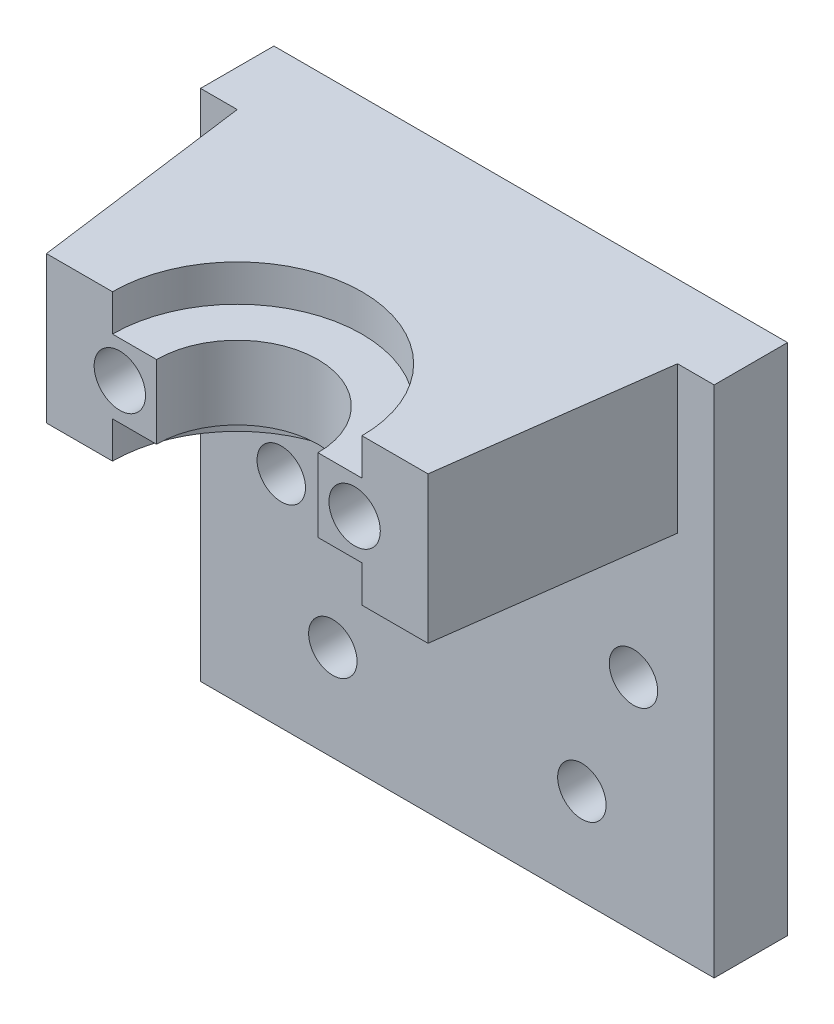
ISO-10303-21;
HEADER;
FILE_DESCRIPTION(('STEP AP214'),'2;1');
FILE_NAME('part.step','',(''),(''),'','','');
FILE_SCHEMA(('AUTOMOTIVE_DESIGN { 1 0 10303 214 1 1 1 1 }'));
ENDSEC;
DATA;
#1=APPLICATION_CONTEXT('core data for automotive mechanical design processes');
#2=APPLICATION_PROTOCOL_DEFINITION('international standard','automotive_design',2000,#1);
#3=PRODUCT_CONTEXT('',#1,'mechanical');
#4=PRODUCT('Part','Part','',(#3));
#5=PRODUCT_RELATED_PRODUCT_CATEGORY('part','',(#4));
#6=PRODUCT_DEFINITION_FORMATION('','',#4);
#7=PRODUCT_DEFINITION_CONTEXT('part definition',#1,'design');
#8=PRODUCT_DEFINITION('design','',#6,#7);
#9=PRODUCT_DEFINITION_SHAPE('','',#8);
#10=(LENGTH_UNIT() NAMED_UNIT(*) SI_UNIT(.MILLI.,.METRE.));
#11=(NAMED_UNIT(*) PLANE_ANGLE_UNIT() SI_UNIT($,.RADIAN.));
#12=(NAMED_UNIT(*) SI_UNIT($,.STERADIAN.) SOLID_ANGLE_UNIT());
#13=UNCERTAINTY_MEASURE_WITH_UNIT(LENGTH_MEASURE(1.E-05),#10,'distance_accuracy_value','');
#14=(GEOMETRIC_REPRESENTATION_CONTEXT(3) GLOBAL_UNCERTAINTY_ASSIGNED_CONTEXT((#13)) GLOBAL_UNIT_ASSIGNED_CONTEXT((#10,
#11,#12)) REPRESENTATION_CONTEXT('',''));
#15=CARTESIAN_POINT('',(0.,0.,0.));
#16=DIRECTION('',(0.,0.,1.));
#17=DIRECTION('',(1.,0.,0.));
#18=AXIS2_PLACEMENT_3D('',#15,#16,#17);
#19=CARTESIAN_POINT('',(0.,0.,5.));
#20=DIRECTION('',(0.,0.,1.));
#21=DIRECTION('',(1.,0.,0.));
#22=AXIS2_PLACEMENT_3D('',#19,#20,#21);
#23=PLANE('',#22);
#24=CARTESIAN_POINT('',(-12.,0.,5.));
#25=DIRECTION('',(0.,0.,1.));
#26=DIRECTION('',(1.,0.,0.));
#27=AXIS2_PLACEMENT_3D('',#24,#25,#26);
#28=CIRCLE('',#27,1.65);
#29=CARTESIAN_POINT('',(-10.35,0.,5.));
#30=VERTEX_POINT('',#29);
#31=EDGE_CURVE('E266',#30,#30,#28,.T.);
#32=ORIENTED_EDGE('',*,*,#31,.F.);
#33=EDGE_LOOP('',(#32));
#34=FACE_BOUND('',#33,.T.);
#35=CARTESIAN_POINT('',(8.48528137423857,-8.48528137423857,5.));
#36=DIRECTION('',(0.,0.,1.));
#37=DIRECTION('',(1.,0.,0.));
#38=AXIS2_PLACEMENT_3D('',#35,#36,#37);
#39=CIRCLE('',#38,1.65);
#40=CARTESIAN_POINT('',(10.1352813742386,-8.48528137423857,5.));
#41=VERTEX_POINT('',#40);
#42=EDGE_CURVE('E278',#41,#41,#39,.T.);
#43=ORIENTED_EDGE('',*,*,#42,.F.);
#44=EDGE_LOOP('',(#43));
#45=FACE_BOUND('',#44,.T.);
#46=CARTESIAN_POINT('',(12.,0.,5.));
#47=DIRECTION('',(0.,0.,1.));
#48=DIRECTION('',(1.,0.,0.));
#49=AXIS2_PLACEMENT_3D('',#46,#47,#48);
#50=CIRCLE('',#49,1.65);
#51=CARTESIAN_POINT('',(13.65,0.,5.));
#52=VERTEX_POINT('',#51);
#53=EDGE_CURVE('E284',#52,#52,#50,.T.);
#54=ORIENTED_EDGE('',*,*,#53,.F.);
#55=EDGE_LOOP('',(#54));
#56=FACE_BOUND('',#55,.T.);
#57=CARTESIAN_POINT('',(-8.48528137423857,-8.48528137423857,5.));
#58=DIRECTION('',(0.,0.,1.));
#59=DIRECTION('',(1.,0.,0.));
#60=AXIS2_PLACEMENT_3D('',#57,#58,#59);
#61=CIRCLE('',#60,1.65);
#62=CARTESIAN_POINT('',(-6.83528137423857,-8.48528137423857,5.));
#63=VERTEX_POINT('',#62);
#64=EDGE_CURVE('E272',#63,#63,#61,.T.);
#65=ORIENTED_EDGE('',*,*,#64,.F.);
#66=EDGE_LOOP('',(#65));
#67=FACE_BOUND('',#66,.T.);
#68=DIRECTION('',(0.,1.,0.));
#69=VECTOR('',#68,1.);
#70=CARTESIAN_POINT('',(17.5,0.,5.));
#71=LINE('',#70,#69);
#72=CARTESIAN_POINT('',(17.5,-15.,5.));
#73=VERTEX_POINT('',#72);
#74=CARTESIAN_POINT('',(17.5,20.,5.));
#75=VERTEX_POINT('',#74);
#76=EDGE_CURVE('E178',#73,#75,#71,.T.);
#77=ORIENTED_EDGE('',*,*,#76,.T.);
#78=DIRECTION('',(-1.,0.,0.));
#79=VECTOR('',#78,1.);
#80=CARTESIAN_POINT('',(0.,20.,5.));
#81=LINE('',#80,#79);
#82=CARTESIAN_POINT('',(15.,20.,5.));
#83=VERTEX_POINT('',#82);
#84=EDGE_CURVE('E174',#75,#83,#81,.T.);
#85=ORIENTED_EDGE('',*,*,#84,.T.);
#86=DIRECTION('',(0.,-1.,0.));
#87=VECTOR('',#86,1.);
#88=CARTESIAN_POINT('',(15.,20.,5.));
#89=LINE('',#88,#87);
#90=CARTESIAN_POINT('',(15.,10.,5.));
#91=VERTEX_POINT('',#90);
#92=EDGE_CURVE('E242',#83,#91,#89,.T.);
#93=ORIENTED_EDGE('',*,*,#92,.T.);
#94=DIRECTION('',(-1.,0.,0.));
#95=VECTOR('',#94,1.);
#96=CARTESIAN_POINT('',(15.,10.,5.));
#97=LINE('',#96,#95);
#98=CARTESIAN_POINT('',(9.13959588941565,10.,5.));
#99=VERTEX_POINT('',#98);
#100=EDGE_CURVE('E226',#91,#99,#97,.T.);
#101=ORIENTED_EDGE('',*,*,#100,.T.);
#102=CARTESIAN_POINT('',(8.48528137423857,8.48528137423857,5.));
#103=DIRECTION('',(0.,0.,1.));
#104=DIRECTION('',(1.,0.,0.));
#105=AXIS2_PLACEMENT_3D('',#102,#103,#104);
#106=CIRCLE('',#105,1.65);
#107=CARTESIAN_POINT('',(7.83096685906149,10.,5.));
#108=VERTEX_POINT('',#107);
#109=EDGE_CURVE('E256',#108,#99,#106,.T.);
#110=ORIENTED_EDGE('',*,*,#109,.F.);
#111=CARTESIAN_POINT('',(-7.8309668590615,10.,5.));
#112=VERTEX_POINT('',#111);
#113=EDGE_CURVE('E288',#108,#112,#97,.T.);
#114=ORIENTED_EDGE('',*,*,#113,.T.);
#115=CARTESIAN_POINT('',(-8.48528137423857,8.48528137423857,5.));
#116=DIRECTION('',(0.,0.,1.));
#117=DIRECTION('',(1.,0.,0.));
#118=AXIS2_PLACEMENT_3D('',#115,#116,#117);
#119=CIRCLE('',#118,1.65);
#120=CARTESIAN_POINT('',(-9.13959588941565,10.,5.));
#121=VERTEX_POINT('',#120);
#122=EDGE_CURVE('E263',#121,#112,#119,.T.);
#123=ORIENTED_EDGE('',*,*,#122,.F.);
#124=CARTESIAN_POINT('',(-15.,10.,5.));
#125=VERTEX_POINT('',#124);
#126=EDGE_CURVE('E231',#121,#125,#97,.T.);
#127=ORIENTED_EDGE('',*,*,#126,.T.);
#128=DIRECTION('',(0.,-1.,0.));
#129=VECTOR('',#128,1.);
#130=CARTESIAN_POINT('',(-15.,20.,5.));
#131=LINE('',#130,#129);
#132=CARTESIAN_POINT('',(-15.,20.,5.));
#133=VERTEX_POINT('',#132);
#134=EDGE_CURVE('E240',#133,#125,#131,.T.);
#135=ORIENTED_EDGE('',*,*,#134,.F.);
#136=CARTESIAN_POINT('',(-17.5,20.,5.));
#137=VERTEX_POINT('',#136);
#138=EDGE_CURVE('E169',#133,#137,#81,.T.);
#139=ORIENTED_EDGE('',*,*,#138,.T.);
#140=DIRECTION('',(0.,-1.,0.));
#141=VECTOR('',#140,1.);
#142=CARTESIAN_POINT('',(-17.5,0.,5.));
#143=LINE('',#142,#141);
#144=CARTESIAN_POINT('',(-17.5,-15.,5.));
#145=VERTEX_POINT('',#144);
#146=EDGE_CURVE('E175',#137,#145,#143,.T.);
#147=ORIENTED_EDGE('',*,*,#146,.T.);
#148=DIRECTION('',(1.,0.,0.));
#149=VECTOR('',#148,1.);
#150=CARTESIAN_POINT('',(0.,-15.,5.));
#151=LINE('',#150,#149);
#152=EDGE_CURVE('E152',#145,#73,#151,.T.);
#153=ORIENTED_EDGE('',*,*,#152,.T.);
#154=EDGE_LOOP('',(#77,#85,#93,#101,#110,#114,#123,#127,#135,#139,#147,#153));
#155=FACE_BOUND('',#154,.T.);
#156=ADVANCED_FACE('F32',(#34,#45,#56,#67,#155),#23,.T.);
#157=CARTESIAN_POINT('',(0.,0.,0.));
#158=DIRECTION('',(0.,0.,1.));
#159=DIRECTION('',(1.,0.,0.));
#160=AXIS2_PLACEMENT_3D('',#157,#158,#159);
#161=PLANE('',#160);
#162=CARTESIAN_POINT('',(7.99999999999998,15.,0.));
#163=DIRECTION('',(0.,0.,1.));
#164=DIRECTION('',(1.,0.,0.));
#165=AXIS2_PLACEMENT_3D('',#162,#163,#164);
#166=CIRCLE('',#165,1.75);
#167=CARTESIAN_POINT('',(9.74999999999998,15.,0.));
#168=VERTEX_POINT('',#167);
#169=EDGE_CURVE('E425',#168,#168,#166,.T.);
#170=ORIENTED_EDGE('',*,*,#169,.T.);
#171=EDGE_LOOP('',(#170));
#172=FACE_BOUND('',#171,.T.);
#173=CARTESIAN_POINT('',(-8.00000000000002,15.,0.));
#174=DIRECTION('',(0.,0.,1.));
#175=DIRECTION('',(1.,0.,0.));
#176=AXIS2_PLACEMENT_3D('',#173,#174,#175);
#177=CIRCLE('',#176,1.75);
#178=CARTESIAN_POINT('',(-6.25000000000002,15.,0.));
#179=VERTEX_POINT('',#178);
#180=EDGE_CURVE('E433',#179,#179,#177,.T.);
#181=ORIENTED_EDGE('',*,*,#180,.T.);
#182=EDGE_LOOP('',(#181));
#183=FACE_BOUND('',#182,.T.);
#184=CARTESIAN_POINT('',(8.48528137423857,8.48528137423857,0.));
#185=DIRECTION('',(0.,0.,1.));
#186=DIRECTION('',(1.,0.,0.));
#187=AXIS2_PLACEMENT_3D('',#184,#185,#186);
#188=CIRCLE('',#187,1.65);
#189=CARTESIAN_POINT('',(10.1352813742386,8.48528137423857,0.));
#190=VERTEX_POINT('',#189);
#191=EDGE_CURVE('E251',#190,#190,#188,.T.);
#192=ORIENTED_EDGE('',*,*,#191,.T.);
#193=EDGE_LOOP('',(#192));
#194=FACE_BOUND('',#193,.T.);
#195=CARTESIAN_POINT('',(-8.48528137423857,8.48528137423857,0.));
#196=DIRECTION('',(0.,0.,1.));
#197=DIRECTION('',(1.,0.,0.));
#198=AXIS2_PLACEMENT_3D('',#195,#196,#197);
#199=CIRCLE('',#198,1.65);
#200=CARTESIAN_POINT('',(-6.83528137423857,8.48528137423857,0.));
#201=VERTEX_POINT('',#200);
#202=EDGE_CURVE('E255',#201,#201,#199,.T.);
#203=ORIENTED_EDGE('',*,*,#202,.T.);
#204=EDGE_LOOP('',(#203));
#205=FACE_BOUND('',#204,.T.);
#206=CARTESIAN_POINT('',(-12.,0.,0.));
#207=DIRECTION('',(0.,0.,1.));
#208=DIRECTION('',(1.,0.,0.));
#209=AXIS2_PLACEMENT_3D('',#206,#207,#208);
#210=CIRCLE('',#209,1.65);
#211=CARTESIAN_POINT('',(-10.35,0.,0.));
#212=VERTEX_POINT('',#211);
#213=EDGE_CURVE('E262',#212,#212,#210,.T.);
#214=ORIENTED_EDGE('',*,*,#213,.T.);
#215=EDGE_LOOP('',(#214));
#216=FACE_BOUND('',#215,.T.);
#217=CARTESIAN_POINT('',(-8.48528137423857,-8.48528137423857,0.));
#218=DIRECTION('',(0.,0.,1.));
#219=DIRECTION('',(1.,0.,0.));
#220=AXIS2_PLACEMENT_3D('',#217,#218,#219);
#221=CIRCLE('',#220,1.65);
#222=CARTESIAN_POINT('',(-6.83528137423857,-8.48528137423857,0.));
#223=VERTEX_POINT('',#222);
#224=EDGE_CURVE('E269',#223,#223,#221,.T.);
#225=ORIENTED_EDGE('',*,*,#224,.T.);
#226=EDGE_LOOP('',(#225));
#227=FACE_BOUND('',#226,.T.);
#228=CARTESIAN_POINT('',(8.48528137423857,-8.48528137423857,0.));
#229=DIRECTION('',(0.,0.,1.));
#230=DIRECTION('',(1.,0.,0.));
#231=AXIS2_PLACEMENT_3D('',#228,#229,#230);
#232=CIRCLE('',#231,1.65);
#233=CARTESIAN_POINT('',(10.1352813742386,-8.48528137423857,0.));
#234=VERTEX_POINT('',#233);
#235=EDGE_CURVE('E275',#234,#234,#232,.T.);
#236=ORIENTED_EDGE('',*,*,#235,.T.);
#237=EDGE_LOOP('',(#236));
#238=FACE_BOUND('',#237,.T.);
#239=CARTESIAN_POINT('',(12.,0.,0.));
#240=DIRECTION('',(0.,0.,1.));
#241=DIRECTION('',(1.,0.,0.));
#242=AXIS2_PLACEMENT_3D('',#239,#240,#241);
#243=CIRCLE('',#242,1.65);
#244=CARTESIAN_POINT('',(13.65,0.,0.));
#245=VERTEX_POINT('',#244);
#246=EDGE_CURVE('E281',#245,#245,#243,.T.);
#247=ORIENTED_EDGE('',*,*,#246,.T.);
#248=EDGE_LOOP('',(#247));
#249=FACE_BOUND('',#248,.T.);
#250=DIRECTION('',(0.,1.,0.));
#251=VECTOR('',#250,1.);
#252=CARTESIAN_POINT('',(17.5,-15.,0.));
#253=LINE('',#252,#251);
#254=CARTESIAN_POINT('',(17.5,-15.,0.));
#255=VERTEX_POINT('',#254);
#256=CARTESIAN_POINT('',(17.5,20.,0.));
#257=VERTEX_POINT('',#256);
#258=EDGE_CURVE('E55',#255,#257,#253,.T.);
#259=ORIENTED_EDGE('',*,*,#258,.F.);
#260=DIRECTION('',(1.,0.,0.));
#261=VECTOR('',#260,1.);
#262=CARTESIAN_POINT('',(-17.5,-15.,0.));
#263=LINE('',#262,#261);
#264=CARTESIAN_POINT('',(-17.5,-15.,0.));
#265=VERTEX_POINT('',#264);
#266=EDGE_CURVE('E150',#265,#255,#263,.T.);
#267=ORIENTED_EDGE('',*,*,#266,.F.);
#268=DIRECTION('',(0.,-1.,0.));
#269=VECTOR('',#268,1.);
#270=CARTESIAN_POINT('',(-17.5,-15.,0.));
#271=LINE('',#270,#269);
#272=CARTESIAN_POINT('',(-17.5,20.,0.));
#273=VERTEX_POINT('',#272);
#274=EDGE_CURVE('E158',#273,#265,#271,.T.);
#275=ORIENTED_EDGE('',*,*,#274,.F.);
#276=DIRECTION('',(-1.,0.,0.));
#277=VECTOR('',#276,1.);
#278=CARTESIAN_POINT('',(-17.5,20.,0.));
#279=LINE('',#278,#277);
#280=EDGE_CURVE('E162',#257,#273,#279,.T.);
#281=ORIENTED_EDGE('',*,*,#280,.F.);
#282=EDGE_LOOP('',(#259,#267,#275,#281));
#283=FACE_BOUND('',#282,.T.);
#284=ADVANCED_FACE('F34',(#172,#183,#194,#205,#216,#227,#238,#249,#283),#161,.F.);
#285=CARTESIAN_POINT('',(0.,20.,20.));
#286=DIRECTION('',(0.,-1.,0.));
#287=DIRECTION('',(0.,0.,-1.));
#288=AXIS2_PLACEMENT_3D('',#285,#286,#287);
#289=CYLINDRICAL_SURFACE('',#288,5.5);
#290=CARTESIAN_POINT('',(0.,12.5,20.));
#291=DIRECTION('',(0.,-1.,0.));
#292=DIRECTION('',(0.,0.,-1.));
#293=AXIS2_PLACEMENT_3D('',#290,#291,#292);
#294=CIRCLE('',#293,5.5);
#295=CARTESIAN_POINT('',(5.5,12.5,20.));
#296=VERTEX_POINT('',#295);
#297=CARTESIAN_POINT('',(-5.5,12.5,20.));
#298=VERTEX_POINT('',#297);
#299=EDGE_CURVE('E191',#296,#298,#294,.F.);
#300=ORIENTED_EDGE('',*,*,#299,.F.);
#301=DIRECTION('',(0.,-1.,0.));
#302=VECTOR('',#301,1.);
#303=CARTESIAN_POINT('',(5.5,20.,20.));
#304=LINE('',#303,#302);
#305=CARTESIAN_POINT('',(5.5,17.5,20.));
#306=VERTEX_POINT('',#305);
#307=EDGE_CURVE('E248',#306,#296,#304,.T.);
#308=ORIENTED_EDGE('',*,*,#307,.F.);
#309=CARTESIAN_POINT('',(0.,17.5,20.));
#310=DIRECTION('',(0.,1.,0.));
#311=DIRECTION('',(0.,0.,1.));
#312=AXIS2_PLACEMENT_3D('',#309,#310,#311);
#313=CIRCLE('',#312,5.5);
#314=CARTESIAN_POINT('',(-5.5,17.5,20.));
#315=VERTEX_POINT('',#314);
#316=EDGE_CURVE('E204',#315,#306,#313,.F.);
#317=ORIENTED_EDGE('',*,*,#316,.F.);
#318=DIRECTION('',(0.,-1.,0.));
#319=VECTOR('',#318,1.);
#320=CARTESIAN_POINT('',(-5.5,20.,20.));
#321=LINE('',#320,#319);
#322=EDGE_CURVE('E220',#315,#298,#321,.T.);
#323=ORIENTED_EDGE('',*,*,#322,.T.);
#324=EDGE_LOOP('',(#300,#308,#317,#323));
#325=FACE_BOUND('',#324,.T.);
#326=ADVANCED_FACE('F318',(#325),#289,.F.);
#327=CARTESIAN_POINT('',(5.5,20.,20.));
#328=DIRECTION('',(0.,0.,-1.));
#329=DIRECTION('',(-1.,0.,0.));
#330=AXIS2_PLACEMENT_3D('',#327,#328,#329);
#331=PLANE('',#330);
#332=CARTESIAN_POINT('',(7.99999999999998,15.,20.));
#333=DIRECTION('',(0.,0.,1.));
#334=DIRECTION('',(1.,0.,0.));
#335=AXIS2_PLACEMENT_3D('',#332,#333,#334);
#336=CIRCLE('',#335,1.75);
#337=CARTESIAN_POINT('',(9.74999999999998,15.,20.));
#338=VERTEX_POINT('',#337);
#339=EDGE_CURVE('E428',#338,#338,#336,.T.);
#340=ORIENTED_EDGE('',*,*,#339,.F.);
#341=EDGE_LOOP('',(#340));
#342=FACE_BOUND('',#341,.T.);
#343=DIRECTION('',(-1.,0.,0.));
#344=VECTOR('',#343,1.);
#345=CARTESIAN_POINT('',(5.5,12.5,20.));
#346=LINE('',#345,#344);
#347=CARTESIAN_POINT('',(8.5,12.5,20.));
#348=VERTEX_POINT('',#347);
#349=EDGE_CURVE('E193',#348,#296,#346,.T.);
#350=ORIENTED_EDGE('',*,*,#349,.F.);
#351=DIRECTION('',(0.,1.,0.));
#352=VECTOR('',#351,1.);
#353=CARTESIAN_POINT('',(8.5,20.,20.));
#354=LINE('',#353,#352);
#355=CARTESIAN_POINT('',(8.5,10.,20.));
#356=VERTEX_POINT('',#355);
#357=EDGE_CURVE('E189',#356,#348,#354,.T.);
#358=ORIENTED_EDGE('',*,*,#357,.F.);
#359=DIRECTION('',(1.,0.,0.));
#360=VECTOR('',#359,1.);
#361=CARTESIAN_POINT('',(5.5,10.,20.));
#362=LINE('',#361,#360);
#363=CARTESIAN_POINT('',(13.,10.,20.));
#364=VERTEX_POINT('',#363);
#365=EDGE_CURVE('E208',#356,#364,#362,.T.);
#366=ORIENTED_EDGE('',*,*,#365,.T.);
#367=DIRECTION('',(0.,-1.,0.));
#368=VECTOR('',#367,1.);
#369=CARTESIAN_POINT('',(13.,20.,20.));
#370=LINE('',#369,#368);
#371=CARTESIAN_POINT('',(13.,20.,20.));
#372=VERTEX_POINT('',#371);
#373=EDGE_CURVE('E245',#372,#364,#370,.T.);
#374=ORIENTED_EDGE('',*,*,#373,.F.);
#375=DIRECTION('',(1.,0.,0.));
#376=VECTOR('',#375,1.);
#377=CARTESIAN_POINT('',(5.5,20.,20.));
#378=LINE('',#377,#376);
#379=CARTESIAN_POINT('',(8.5,20.,20.));
#380=VERTEX_POINT('',#379);
#381=EDGE_CURVE('E209',#380,#372,#378,.T.);
#382=ORIENTED_EDGE('',*,*,#381,.F.);
#383=DIRECTION('',(0.,1.,0.));
#384=VECTOR('',#383,1.);
#385=CARTESIAN_POINT('',(8.5,20.,20.));
#386=LINE('',#385,#384);
#387=CARTESIAN_POINT('',(8.5,17.5,20.));
#388=VERTEX_POINT('',#387);
#389=EDGE_CURVE('E202',#388,#380,#386,.T.);
#390=ORIENTED_EDGE('',*,*,#389,.F.);
#391=DIRECTION('',(1.,0.,0.));
#392=VECTOR('',#391,1.);
#393=CARTESIAN_POINT('',(5.5,17.5,20.));
#394=LINE('',#393,#392);
#395=EDGE_CURVE('E206',#306,#388,#394,.T.);
#396=ORIENTED_EDGE('',*,*,#395,.F.);
#397=ORIENTED_EDGE('',*,*,#307,.T.);
#398=EDGE_LOOP('',(#350,#358,#366,#374,#382,#390,#396,#397));
#399=FACE_BOUND('',#398,.T.);
#400=ADVANCED_FACE('F341',(#342,#399),#331,.F.);
#401=CARTESIAN_POINT('',(-13.,20.,20.));
#402=DIRECTION('',(0.,0.,-1.));
#403=DIRECTION('',(-1.,0.,0.));
#404=AXIS2_PLACEMENT_3D('',#401,#402,#403);
#405=PLANE('',#404);
#406=CARTESIAN_POINT('',(-8.00000000000002,15.,20.));
#407=DIRECTION('',(0.,0.,1.));
#408=DIRECTION('',(1.,0.,0.));
#409=AXIS2_PLACEMENT_3D('',#406,#407,#408);
#410=CIRCLE('',#409,1.75);
#411=CARTESIAN_POINT('',(-6.25000000000002,15.,20.));
#412=VERTEX_POINT('',#411);
#413=EDGE_CURVE('E430',#412,#412,#410,.T.);
#414=ORIENTED_EDGE('',*,*,#413,.F.);
#415=EDGE_LOOP('',(#414));
#416=FACE_BOUND('',#415,.T.);
#417=DIRECTION('',(-1.,0.,0.));
#418=VECTOR('',#417,1.);
#419=CARTESIAN_POINT('',(-13.,12.5,20.));
#420=LINE('',#419,#418);
#421=CARTESIAN_POINT('',(-8.5,12.5,20.));
#422=VERTEX_POINT('',#421);
#423=EDGE_CURVE('E11',#298,#422,#420,.T.);
#424=ORIENTED_EDGE('',*,*,#423,.F.);
#425=ORIENTED_EDGE('',*,*,#322,.F.);
#426=DIRECTION('',(1.,0.,0.));
#427=VECTOR('',#426,1.);
#428=CARTESIAN_POINT('',(-13.,17.5,20.));
#429=LINE('',#428,#427);
#430=CARTESIAN_POINT('',(-8.5,17.5,20.));
#431=VERTEX_POINT('',#430);
#432=EDGE_CURVE('E40',#431,#315,#429,.T.);
#433=ORIENTED_EDGE('',*,*,#432,.F.);
#434=DIRECTION('',(0.,1.,0.));
#435=VECTOR('',#434,1.);
#436=CARTESIAN_POINT('',(-8.5,20.,20.));
#437=LINE('',#436,#435);
#438=CARTESIAN_POINT('',(-8.5,20.,20.));
#439=VERTEX_POINT('',#438);
#440=EDGE_CURVE('E200',#439,#431,#437,.F.);
#441=ORIENTED_EDGE('',*,*,#440,.F.);
#442=DIRECTION('',(1.,0.,0.));
#443=VECTOR('',#442,1.);
#444=CARTESIAN_POINT('',(-13.,20.,20.));
#445=LINE('',#444,#443);
#446=CARTESIAN_POINT('',(-13.,20.,20.));
#447=VERTEX_POINT('',#446);
#448=EDGE_CURVE('E217',#447,#439,#445,.T.);
#449=ORIENTED_EDGE('',*,*,#448,.F.);
#450=DIRECTION('',(0.,-1.,0.));
#451=VECTOR('',#450,1.);
#452=CARTESIAN_POINT('',(-13.,20.,20.));
#453=LINE('',#452,#451);
#454=CARTESIAN_POINT('',(-13.,10.,20.));
#455=VERTEX_POINT('',#454);
#456=EDGE_CURVE('E237',#447,#455,#453,.T.);
#457=ORIENTED_EDGE('',*,*,#456,.T.);
#458=DIRECTION('',(1.,0.,0.));
#459=VECTOR('',#458,1.);
#460=CARTESIAN_POINT('',(-13.,10.,20.));
#461=LINE('',#460,#459);
#462=CARTESIAN_POINT('',(-8.5,10.,20.));
#463=VERTEX_POINT('',#462);
#464=EDGE_CURVE('E212',#455,#463,#461,.T.);
#465=ORIENTED_EDGE('',*,*,#464,.T.);
#466=DIRECTION('',(0.,1.,0.));
#467=VECTOR('',#466,1.);
#468=CARTESIAN_POINT('',(-8.5,20.,20.));
#469=LINE('',#468,#467);
#470=EDGE_CURVE('E187',#422,#463,#469,.F.);
#471=ORIENTED_EDGE('',*,*,#470,.F.);
#472=EDGE_LOOP('',(#424,#425,#433,#441,#449,#457,#465,#471));
#473=FACE_BOUND('',#472,.T.);
#474=ADVANCED_FACE('F331',(#416,#473),#405,.F.);
#475=CARTESIAN_POINT('',(12.,0.,5.));
#476=DIRECTION('',(0.,0.,-1.));
#477=DIRECTION('',(-1.,0.,0.));
#478=AXIS2_PLACEMENT_3D('',#475,#476,#477);
#479=CYLINDRICAL_SURFACE('',#478,1.65);
#480=ORIENTED_EDGE('',*,*,#53,.T.);
#481=EDGE_LOOP('',(#480));
#482=FACE_BOUND('',#481,.T.);
#483=ORIENTED_EDGE('',*,*,#246,.F.);
#484=EDGE_LOOP('',(#483));
#485=FACE_BOUND('',#484,.T.);
#486=ADVANCED_FACE('F328',(#482,#485),#479,.F.);
#487=CARTESIAN_POINT('',(8.48528137423857,-8.48528137423857,5.));
#488=DIRECTION('',(0.,0.,-1.));
#489=DIRECTION('',(-1.,0.,0.));
#490=AXIS2_PLACEMENT_3D('',#487,#488,#489);
#491=CYLINDRICAL_SURFACE('',#490,1.65);
#492=ORIENTED_EDGE('',*,*,#42,.T.);
#493=EDGE_LOOP('',(#492));
#494=FACE_BOUND('',#493,.T.);
#495=ORIENTED_EDGE('',*,*,#235,.F.);
#496=EDGE_LOOP('',(#495));
#497=FACE_BOUND('',#496,.T.);
#498=ADVANCED_FACE('F330',(#494,#497),#491,.F.);
#499=CARTESIAN_POINT('',(-8.48528137423857,-8.48528137423857,5.));
#500=DIRECTION('',(0.,0.,-1.));
#501=DIRECTION('',(-1.,0.,0.));
#502=AXIS2_PLACEMENT_3D('',#499,#500,#501);
#503=CYLINDRICAL_SURFACE('',#502,1.65);
#504=ORIENTED_EDGE('',*,*,#64,.T.);
#505=EDGE_LOOP('',(#504));
#506=FACE_BOUND('',#505,.T.);
#507=ORIENTED_EDGE('',*,*,#224,.F.);
#508=EDGE_LOOP('',(#507));
#509=FACE_BOUND('',#508,.T.);
#510=ADVANCED_FACE('F338',(#506,#509),#503,.F.);
#511=CARTESIAN_POINT('',(-12.,0.,5.));
#512=DIRECTION('',(0.,0.,-1.));
#513=DIRECTION('',(-1.,0.,0.));
#514=AXIS2_PLACEMENT_3D('',#511,#512,#513);
#515=CYLINDRICAL_SURFACE('',#514,1.65);
#516=ORIENTED_EDGE('',*,*,#31,.T.);
#517=EDGE_LOOP('',(#516));
#518=FACE_BOUND('',#517,.T.);
#519=ORIENTED_EDGE('',*,*,#213,.F.);
#520=EDGE_LOOP('',(#519));
#521=FACE_BOUND('',#520,.T.);
#522=ADVANCED_FACE('F312',(#518,#521),#515,.F.);
#523=CARTESIAN_POINT('',(-8.48528137423857,8.48528137423857,5.));
#524=DIRECTION('',(0.,0.,-1.));
#525=DIRECTION('',(-1.,0.,0.));
#526=AXIS2_PLACEMENT_3D('',#523,#524,#525);
#527=CYLINDRICAL_SURFACE('',#526,1.65);
#528=EDGE_CURVE('E259',#112,#121,#119,.T.);
#529=ORIENTED_EDGE('',*,*,#528,.T.);
#530=ORIENTED_EDGE('',*,*,#122,.T.);
#531=EDGE_LOOP('',(#529,#530));
#532=FACE_BOUND('',#531,.T.);
#533=ORIENTED_EDGE('',*,*,#202,.F.);
#534=EDGE_LOOP('',(#533));
#535=FACE_BOUND('',#534,.T.);
#536=ADVANCED_FACE('F308',(#532,#535),#527,.F.);
#537=CARTESIAN_POINT('',(8.48528137423857,8.48528137423857,5.));
#538=DIRECTION('',(0.,0.,-1.));
#539=DIRECTION('',(-1.,0.,0.));
#540=AXIS2_PLACEMENT_3D('',#537,#538,#539);
#541=CYLINDRICAL_SURFACE('',#540,1.65);
#542=EDGE_CURVE('E252',#99,#108,#106,.T.);
#543=ORIENTED_EDGE('',*,*,#542,.T.);
#544=ORIENTED_EDGE('',*,*,#109,.T.);
#545=EDGE_LOOP('',(#543,#544));
#546=FACE_BOUND('',#545,.T.);
#547=ORIENTED_EDGE('',*,*,#191,.F.);
#548=EDGE_LOOP('',(#547));
#549=FACE_BOUND('',#548,.T.);
#550=ADVANCED_FACE('F311',(#546,#549),#541,.F.);
#551=CARTESIAN_POINT('',(15.,20.,5.));
#552=DIRECTION('',(0.,0.,1.));
#553=DIRECTION('',(1.,0.,0.));
#554=AXIS2_PLACEMENT_3D('',#551,#552,#553);
#555=PLANE('',#554);
#556=ORIENTED_EDGE('',*,*,#528,.F.);
#557=EDGE_CURVE('E225',#112,#121,#97,.T.);
#558=ORIENTED_EDGE('',*,*,#557,.T.);
#559=EDGE_LOOP('',(#556,#558));
#560=FACE_BOUND('',#559,.T.);
#561=ADVANCED_FACE('F304',(#560),#555,.F.);
#562=CARTESIAN_POINT('',(13.,20.,20.));
#563=DIRECTION('',(-0.991227900682635,0.,-0.132163720091018));
#564=DIRECTION('',(-0.132163720091018,0.,0.991227900682635));
#565=AXIS2_PLACEMENT_3D('',#562,#563,#564);
#566=PLANE('',#565);
#567=DIRECTION('',(0.132163720091018,0.,-0.991227900682635));
#568=VECTOR('',#567,1.);
#569=CARTESIAN_POINT('',(13.,10.,20.));
#570=LINE('',#569,#568);
#571=EDGE_CURVE('E222',#364,#91,#570,.T.);
#572=ORIENTED_EDGE('',*,*,#571,.T.);
#573=ORIENTED_EDGE('',*,*,#92,.F.);
#574=DIRECTION('',(0.132163720091018,0.,-0.991227900682635));
#575=VECTOR('',#574,1.);
#576=CARTESIAN_POINT('',(13.,20.,20.));
#577=LINE('',#576,#575);
#578=EDGE_CURVE('E211',#372,#83,#577,.T.);
#579=ORIENTED_EDGE('',*,*,#578,.F.);
#580=ORIENTED_EDGE('',*,*,#373,.T.);
#581=EDGE_LOOP('',(#572,#573,#579,#580));
#582=FACE_BOUND('',#581,.T.);
#583=ADVANCED_FACE('F374',(#582),#566,.F.);
#584=ORIENTED_EDGE('',*,*,#542,.F.);
#585=EDGE_CURVE('E230',#99,#108,#97,.T.);
#586=ORIENTED_EDGE('',*,*,#585,.T.);
#587=EDGE_LOOP('',(#584,#586));
#588=FACE_BOUND('',#587,.T.);
#589=ADVANCED_FACE('F377',(#588),#555,.F.);
#590=CARTESIAN_POINT('',(-15.,20.,5.));
#591=DIRECTION('',(0.991227900682635,0.,-0.132163720091018));
#592=DIRECTION('',(-0.132163720091018,0.,-0.991227900682635));
#593=AXIS2_PLACEMENT_3D('',#590,#591,#592);
#594=PLANE('',#593);
#595=DIRECTION('',(0.132163720091018,0.,0.991227900682635));
#596=VECTOR('',#595,1.);
#597=CARTESIAN_POINT('',(-15.,10.,5.));
#598=LINE('',#597,#596);
#599=EDGE_CURVE('E229',#125,#455,#598,.T.);
#600=ORIENTED_EDGE('',*,*,#599,.T.);
#601=ORIENTED_EDGE('',*,*,#456,.F.);
#602=DIRECTION('',(0.132163720091018,0.,0.991227900682635));
#603=VECTOR('',#602,1.);
#604=CARTESIAN_POINT('',(-15.,20.,5.));
#605=LINE('',#604,#603);
#606=EDGE_CURVE('E215',#133,#447,#605,.T.);
#607=ORIENTED_EDGE('',*,*,#606,.F.);
#608=ORIENTED_EDGE('',*,*,#134,.T.);
#609=EDGE_LOOP('',(#600,#601,#607,#608));
#610=FACE_BOUND('',#609,.T.);
#611=ADVANCED_FACE('F381',(#610),#594,.F.);
#612=CARTESIAN_POINT('',(0.,20.,20.));
#613=DIRECTION('',(0.,1.,0.));
#614=DIRECTION('',(0.,0.,1.));
#615=AXIS2_PLACEMENT_3D('',#612,#613,#614);
#616=PLANE('',#615);
#617=ORIENTED_EDGE('',*,*,#448,.T.);
#618=CARTESIAN_POINT('',(0.,20.,20.));
#619=DIRECTION('',(0.,1.,0.));
#620=DIRECTION('',(0.,0.,1.));
#621=AXIS2_PLACEMENT_3D('',#618,#619,#620);
#622=CIRCLE('',#621,8.5);
#623=EDGE_CURVE('E198',#380,#439,#622,.T.);
#624=ORIENTED_EDGE('',*,*,#623,.F.);
#625=ORIENTED_EDGE('',*,*,#381,.T.);
#626=ORIENTED_EDGE('',*,*,#578,.T.);
#627=ORIENTED_EDGE('',*,*,#84,.F.);
#628=DIRECTION('',(0.,0.,1.));
#629=VECTOR('',#628,1.);
#630=CARTESIAN_POINT('',(17.5,20.,0.));
#631=LINE('',#630,#629);
#632=EDGE_CURVE('E164',#257,#75,#631,.T.);
#633=ORIENTED_EDGE('',*,*,#632,.F.);
#634=ORIENTED_EDGE('',*,*,#280,.T.);
#635=DIRECTION('',(0.,0.,1.));
#636=VECTOR('',#635,1.);
#637=CARTESIAN_POINT('',(-17.5,20.,0.));
#638=LINE('',#637,#636);
#639=EDGE_CURVE('E47',#273,#137,#638,.T.);
#640=ORIENTED_EDGE('',*,*,#639,.T.);
#641=ORIENTED_EDGE('',*,*,#138,.F.);
#642=ORIENTED_EDGE('',*,*,#606,.T.);
#643=EDGE_LOOP('',(#617,#624,#625,#626,#627,#633,#634,#640,#641,#642));
#644=FACE_BOUND('',#643,.T.);
#645=ADVANCED_FACE('F383',(#644),#616,.T.);
#646=CARTESIAN_POINT('',(0.,10.,20.));
#647=DIRECTION('',(0.,1.,0.));
#648=DIRECTION('',(0.,0.,1.));
#649=AXIS2_PLACEMENT_3D('',#646,#647,#648);
#650=PLANE('',#649);
#651=CARTESIAN_POINT('',(0.,10.,20.));
#652=DIRECTION('',(0.,1.,0.));
#653=DIRECTION('',(0.,0.,1.));
#654=AXIS2_PLACEMENT_3D('',#651,#652,#653);
#655=CIRCLE('',#654,8.5);
#656=EDGE_CURVE('E184',#356,#463,#655,.T.);
#657=ORIENTED_EDGE('',*,*,#656,.T.);
#658=ORIENTED_EDGE('',*,*,#464,.F.);
#659=ORIENTED_EDGE('',*,*,#599,.F.);
#660=ORIENTED_EDGE('',*,*,#126,.F.);
#661=ORIENTED_EDGE('',*,*,#557,.F.);
#662=ORIENTED_EDGE('',*,*,#113,.F.);
#663=ORIENTED_EDGE('',*,*,#585,.F.);
#664=ORIENTED_EDGE('',*,*,#100,.F.);
#665=ORIENTED_EDGE('',*,*,#571,.F.);
#666=ORIENTED_EDGE('',*,*,#365,.F.);
#667=EDGE_LOOP('',(#657,#658,#659,#660,#661,#662,#663,#664,#665,#666));
#668=FACE_BOUND('',#667,.T.);
#669=ADVANCED_FACE('F386',(#668),#650,.F.);
#670=CARTESIAN_POINT('',(0.,17.5,11.5));
#671=DIRECTION('',(0.,1.,0.));
#672=DIRECTION('',(0.,0.,1.));
#673=AXIS2_PLACEMENT_3D('',#670,#671,#672);
#674=PLANE('',#673);
#675=ORIENTED_EDGE('',*,*,#395,.T.);
#676=CARTESIAN_POINT('',(0.,17.5,20.));
#677=DIRECTION('',(0.,1.,0.));
#678=DIRECTION('',(0.,0.,1.));
#679=AXIS2_PLACEMENT_3D('',#676,#677,#678);
#680=CIRCLE('',#679,8.5);
#681=EDGE_CURVE('E195',#388,#431,#680,.T.);
#682=ORIENTED_EDGE('',*,*,#681,.T.);
#683=ORIENTED_EDGE('',*,*,#432,.T.);
#684=ORIENTED_EDGE('',*,*,#316,.T.);
#685=EDGE_LOOP('',(#675,#682,#683,#684));
#686=FACE_BOUND('',#685,.T.);
#687=ADVANCED_FACE('F389',(#686),#674,.T.);
#688=CARTESIAN_POINT('',(0.,20.,20.));
#689=DIRECTION('',(0.,1.,0.));
#690=DIRECTION('',(0.,0.,1.));
#691=AXIS2_PLACEMENT_3D('',#688,#689,#690);
#692=CYLINDRICAL_SURFACE('',#691,8.5);
#693=ORIENTED_EDGE('',*,*,#389,.T.);
#694=ORIENTED_EDGE('',*,*,#623,.T.);
#695=ORIENTED_EDGE('',*,*,#440,.T.);
#696=ORIENTED_EDGE('',*,*,#681,.F.);
#697=EDGE_LOOP('',(#693,#694,#695,#696));
#698=FACE_BOUND('',#697,.T.);
#699=ADVANCED_FACE('F392',(#698),#692,.F.);
#700=CARTESIAN_POINT('',(0.,12.5,11.5));
#701=DIRECTION('',(0.,-1.,0.));
#702=DIRECTION('',(0.,0.,-1.));
#703=AXIS2_PLACEMENT_3D('',#700,#701,#702);
#704=PLANE('',#703);
#705=ORIENTED_EDGE('',*,*,#349,.T.);
#706=ORIENTED_EDGE('',*,*,#299,.T.);
#707=ORIENTED_EDGE('',*,*,#423,.T.);
#708=CARTESIAN_POINT('',(0.,12.5,20.));
#709=DIRECTION('',(0.,1.,0.));
#710=DIRECTION('',(0.,0.,1.));
#711=AXIS2_PLACEMENT_3D('',#708,#709,#710);
#712=CIRCLE('',#711,8.5);
#713=EDGE_CURVE('E181',#348,#422,#712,.T.);
#714=ORIENTED_EDGE('',*,*,#713,.F.);
#715=EDGE_LOOP('',(#705,#706,#707,#714));
#716=FACE_BOUND('',#715,.T.);
#717=ADVANCED_FACE('F395',(#716),#704,.T.);
#718=CARTESIAN_POINT('',(0.,20.,20.));
#719=DIRECTION('',(0.,1.,0.));
#720=DIRECTION('',(0.,0.,1.));
#721=AXIS2_PLACEMENT_3D('',#718,#719,#720);
#722=CYLINDRICAL_SURFACE('',#721,8.5);
#723=ORIENTED_EDGE('',*,*,#357,.T.);
#724=ORIENTED_EDGE('',*,*,#713,.T.);
#725=ORIENTED_EDGE('',*,*,#470,.T.);
#726=ORIENTED_EDGE('',*,*,#656,.F.);
#727=EDGE_LOOP('',(#723,#724,#725,#726));
#728=FACE_BOUND('',#727,.T.);
#729=ADVANCED_FACE('F401',(#728),#722,.F.);
#730=CARTESIAN_POINT('',(17.5,-15.,0.));
#731=DIRECTION('',(1.,0.,0.));
#732=DIRECTION('',(0.,0.,-1.));
#733=AXIS2_PLACEMENT_3D('',#730,#731,#732);
#734=PLANE('',#733);
#735=DIRECTION('',(0.,0.,1.));
#736=VECTOR('',#735,1.);
#737=CARTESIAN_POINT('',(17.5,-15.,0.));
#738=LINE('',#737,#736);
#739=EDGE_CURVE('E155',#255,#73,#738,.T.);
#740=ORIENTED_EDGE('',*,*,#739,.F.);
#741=ORIENTED_EDGE('',*,*,#258,.T.);
#742=ORIENTED_EDGE('',*,*,#632,.T.);
#743=ORIENTED_EDGE('',*,*,#76,.F.);
#744=EDGE_LOOP('',(#740,#741,#742,#743));
#745=FACE_BOUND('',#744,.T.);
#746=ADVANCED_FACE('F405',(#745),#734,.T.);
#747=CARTESIAN_POINT('',(-17.5,-15.,0.));
#748=DIRECTION('',(0.,-1.,0.));
#749=DIRECTION('',(0.,0.,-1.));
#750=AXIS2_PLACEMENT_3D('',#747,#748,#749);
#751=PLANE('',#750);
#752=DIRECTION('',(0.,0.,1.));
#753=VECTOR('',#752,1.);
#754=CARTESIAN_POINT('',(-17.5,-15.,0.));
#755=LINE('',#754,#753);
#756=EDGE_CURVE('E145',#265,#145,#755,.T.);
#757=ORIENTED_EDGE('',*,*,#756,.F.);
#758=ORIENTED_EDGE('',*,*,#266,.T.);
#759=ORIENTED_EDGE('',*,*,#739,.T.);
#760=ORIENTED_EDGE('',*,*,#152,.F.);
#761=EDGE_LOOP('',(#757,#758,#759,#760));
#762=FACE_BOUND('',#761,.T.);
#763=ADVANCED_FACE('F147',(#762),#751,.T.);
#764=CARTESIAN_POINT('',(-17.5,-15.,0.));
#765=DIRECTION('',(-1.,0.,0.));
#766=DIRECTION('',(0.,0.,1.));
#767=AXIS2_PLACEMENT_3D('',#764,#765,#766);
#768=PLANE('',#767);
#769=ORIENTED_EDGE('',*,*,#639,.F.);
#770=ORIENTED_EDGE('',*,*,#274,.T.);
#771=ORIENTED_EDGE('',*,*,#756,.T.);
#772=ORIENTED_EDGE('',*,*,#146,.F.);
#773=EDGE_LOOP('',(#769,#770,#771,#772));
#774=FACE_BOUND('',#773,.T.);
#775=ADVANCED_FACE('F159',(#774),#768,.T.);
#776=CARTESIAN_POINT('',(-8.00000000000002,15.,0.));
#777=DIRECTION('',(0.,0.,1.));
#778=DIRECTION('',(1.,0.,0.));
#779=AXIS2_PLACEMENT_3D('',#776,#777,#778);
#780=CYLINDRICAL_SURFACE('',#779,1.75);
#781=ORIENTED_EDGE('',*,*,#180,.F.);
#782=EDGE_LOOP('',(#781));
#783=FACE_BOUND('',#782,.T.);
#784=ORIENTED_EDGE('',*,*,#413,.T.);
#785=EDGE_LOOP('',(#784));
#786=FACE_BOUND('',#785,.T.);
#787=ADVANCED_FACE('F411',(#783,#786),#780,.F.);
#788=CARTESIAN_POINT('',(7.99999999999998,15.,0.));
#789=DIRECTION('',(0.,0.,1.));
#790=DIRECTION('',(1.,0.,0.));
#791=AXIS2_PLACEMENT_3D('',#788,#789,#790);
#792=CYLINDRICAL_SURFACE('',#791,1.75);
#793=ORIENTED_EDGE('',*,*,#169,.F.);
#794=EDGE_LOOP('',(#793));
#795=FACE_BOUND('',#794,.T.);
#796=ORIENTED_EDGE('',*,*,#339,.T.);
#797=EDGE_LOOP('',(#796));
#798=FACE_BOUND('',#797,.T.);
#799=ADVANCED_FACE('F416',(#795,#798),#792,.F.);
#800=CLOSED_SHELL('',(#156,#284,#326,#400,#474,#486,#498,#510,#522,#536,#550,#561,#583,#589,
#611,#645,#669,#687,#699,#717,#729,#746,#763,#775,#787,#799));
#801=MANIFOLD_SOLID_BREP('B2',#800);
#802=ADVANCED_BREP_SHAPE_REPRESENTATION('',(#18,#801),#14);
#803=SHAPE_DEFINITION_REPRESENTATION(#9,#802);
ENDSEC;
END-ISO-10303-21;
